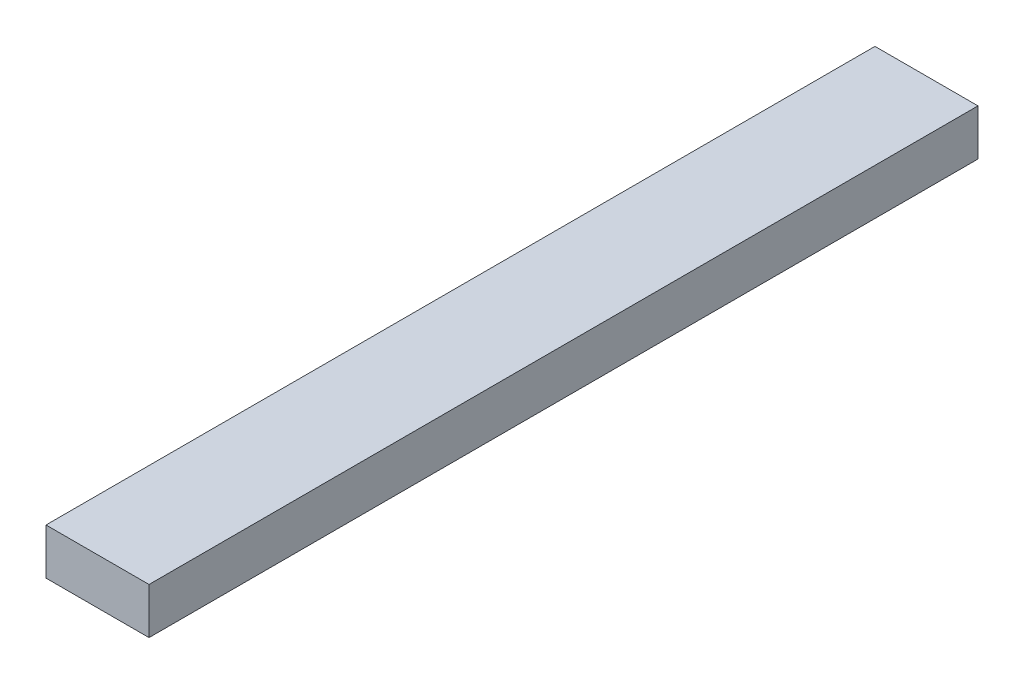
ISO-10303-21;
HEADER;
FILE_DESCRIPTION(('STEP AP214'),'2;1');
FILE_NAME('part.step','',(''),(''),'','','');
FILE_SCHEMA(('AUTOMOTIVE_DESIGN { 1 0 10303 214 1 1 1 1 }'));
ENDSEC;
DATA;
#1=APPLICATION_CONTEXT('core data for automotive mechanical design processes');
#2=APPLICATION_PROTOCOL_DEFINITION('international standard','automotive_design',2000,#1);
#3=PRODUCT_CONTEXT('',#1,'mechanical');
#4=PRODUCT('Part','Part','',(#3));
#5=PRODUCT_RELATED_PRODUCT_CATEGORY('part','',(#4));
#6=PRODUCT_DEFINITION_FORMATION('','',#4);
#7=PRODUCT_DEFINITION_CONTEXT('part definition',#1,'design');
#8=PRODUCT_DEFINITION('design','',#6,#7);
#9=PRODUCT_DEFINITION_SHAPE('','',#8);
#10=(LENGTH_UNIT() NAMED_UNIT(*) SI_UNIT(.MILLI.,.METRE.));
#11=(NAMED_UNIT(*) PLANE_ANGLE_UNIT() SI_UNIT($,.RADIAN.));
#12=(NAMED_UNIT(*) SI_UNIT($,.STERADIAN.) SOLID_ANGLE_UNIT());
#13=UNCERTAINTY_MEASURE_WITH_UNIT(LENGTH_MEASURE(1.E-05),#10,'distance_accuracy_value','');
#14=(GEOMETRIC_REPRESENTATION_CONTEXT(3) GLOBAL_UNCERTAINTY_ASSIGNED_CONTEXT((#13)) GLOBAL_UNIT_ASSIGNED_CONTEXT((#10,
#11,#12)) REPRESENTATION_CONTEXT('',''));
#15=CARTESIAN_POINT('',(0.,0.,0.));
#16=DIRECTION('',(0.,0.,1.));
#17=DIRECTION('',(1.,0.,0.));
#18=AXIS2_PLACEMENT_3D('',#15,#16,#17);
#19=CARTESIAN_POINT('',(18.6436,8.3312,150.));
#20=DIRECTION('',(0.,-1.,0.));
#21=DIRECTION('',(0.,0.,-1.));
#22=AXIS2_PLACEMENT_3D('',#19,#20,#21);
#23=PLANE('',#22);
#24=DIRECTION('',(-1.,0.,0.));
#25=VECTOR('',#24,1.);
#26=CARTESIAN_POINT('',(18.6436,8.3312,-150.));
#27=LINE('',#26,#25);
#28=CARTESIAN_POINT('',(18.6436,8.3312,-150.));
#29=VERTEX_POINT('',#28);
#30=CARTESIAN_POINT('',(-18.6436,8.3312,-150.));
#31=VERTEX_POINT('',#30);
#32=EDGE_CURVE('E104',#29,#31,#27,.T.);
#33=ORIENTED_EDGE('',*,*,#32,.T.);
#34=DIRECTION('',(0.,0.,-1.));
#35=VECTOR('',#34,1.);
#36=CARTESIAN_POINT('',(-18.6436,8.3312,150.));
#37=LINE('',#36,#35);
#38=CARTESIAN_POINT('',(-18.6436,8.3312,150.));
#39=VERTEX_POINT('',#38);
#40=EDGE_CURVE('E11',#39,#31,#37,.T.);
#41=ORIENTED_EDGE('',*,*,#40,.F.);
#42=DIRECTION('',(-1.,0.,0.));
#43=VECTOR('',#42,1.);
#44=CARTESIAN_POINT('',(18.6436,8.3312,150.));
#45=LINE('',#44,#43);
#46=CARTESIAN_POINT('',(18.6436,8.3312,150.));
#47=VERTEX_POINT('',#46);
#48=EDGE_CURVE('E92',#47,#39,#45,.T.);
#49=ORIENTED_EDGE('',*,*,#48,.F.);
#50=DIRECTION('',(0.,0.,-1.));
#51=VECTOR('',#50,1.);
#52=CARTESIAN_POINT('',(18.6436,8.3312,150.));
#53=LINE('',#52,#51);
#54=EDGE_CURVE('E100',#47,#29,#53,.T.);
#55=ORIENTED_EDGE('',*,*,#54,.T.);
#56=EDGE_LOOP('',(#33,#41,#49,#55));
#57=FACE_BOUND('',#56,.T.);
#58=ADVANCED_FACE('F41',(#57),#23,.F.);
#59=CARTESIAN_POINT('',(-18.6436,-8.3312,150.));
#60=DIRECTION('',(1.,0.,0.));
#61=DIRECTION('',(0.,0.,-1.));
#62=AXIS2_PLACEMENT_3D('',#59,#60,#61);
#63=PLANE('',#62);
#64=DIRECTION('',(0.,-1.,0.));
#65=VECTOR('',#64,1.);
#66=CARTESIAN_POINT('',(-18.6436,-8.3312,-150.));
#67=LINE('',#66,#65);
#68=CARTESIAN_POINT('',(-18.6436,-8.3312,-150.));
#69=VERTEX_POINT('',#68);
#70=EDGE_CURVE('E96',#31,#69,#67,.T.);
#71=ORIENTED_EDGE('',*,*,#70,.T.);
#72=DIRECTION('',(0.,0.,-1.));
#73=VECTOR('',#72,1.);
#74=CARTESIAN_POINT('',(-18.6436,-8.3312,150.));
#75=LINE('',#74,#73);
#76=CARTESIAN_POINT('',(-18.6436,-8.3312,150.));
#77=VERTEX_POINT('',#76);
#78=EDGE_CURVE('E49',#77,#69,#75,.T.);
#79=ORIENTED_EDGE('',*,*,#78,.F.);
#80=DIRECTION('',(0.,-1.,0.));
#81=VECTOR('',#80,1.);
#82=CARTESIAN_POINT('',(-18.6436,-8.3312,150.));
#83=LINE('',#82,#81);
#84=EDGE_CURVE('E87',#39,#77,#83,.T.);
#85=ORIENTED_EDGE('',*,*,#84,.F.);
#86=ORIENTED_EDGE('',*,*,#40,.T.);
#87=EDGE_LOOP('',(#71,#79,#85,#86));
#88=FACE_BOUND('',#87,.T.);
#89=ADVANCED_FACE('F95',(#88),#63,.F.);
#90=CARTESIAN_POINT('',(18.6436,-8.3312,150.));
#91=DIRECTION('',(0.,1.,0.));
#92=DIRECTION('',(0.,0.,1.));
#93=AXIS2_PLACEMENT_3D('',#90,#91,#92);
#94=PLANE('',#93);
#95=DIRECTION('',(1.,0.,0.));
#96=VECTOR('',#95,1.);
#97=CARTESIAN_POINT('',(18.6436,-8.3312,-150.));
#98=LINE('',#97,#96);
#99=CARTESIAN_POINT('',(18.6436,-8.3312,-150.));
#100=VERTEX_POINT('',#99);
#101=EDGE_CURVE('E74',#69,#100,#98,.T.);
#102=ORIENTED_EDGE('',*,*,#101,.T.);
#103=DIRECTION('',(0.,0.,-1.));
#104=VECTOR('',#103,1.);
#105=CARTESIAN_POINT('',(18.6436,-8.3312,150.));
#106=LINE('',#105,#104);
#107=CARTESIAN_POINT('',(18.6436,-8.3312,150.));
#108=VERTEX_POINT('',#107);
#109=EDGE_CURVE('E97',#108,#100,#106,.T.);
#110=ORIENTED_EDGE('',*,*,#109,.F.);
#111=DIRECTION('',(1.,0.,0.));
#112=VECTOR('',#111,1.);
#113=CARTESIAN_POINT('',(18.6436,-8.3312,150.));
#114=LINE('',#113,#112);
#115=EDGE_CURVE('E90',#77,#108,#114,.T.);
#116=ORIENTED_EDGE('',*,*,#115,.F.);
#117=ORIENTED_EDGE('',*,*,#78,.T.);
#118=EDGE_LOOP('',(#102,#110,#116,#117));
#119=FACE_BOUND('',#118,.T.);
#120=ADVANCED_FACE('F98',(#119),#94,.F.);
#121=CARTESIAN_POINT('',(18.6436,-8.3312,150.));
#122=DIRECTION('',(-1.,0.,0.));
#123=DIRECTION('',(0.,0.,1.));
#124=AXIS2_PLACEMENT_3D('',#121,#122,#123);
#125=PLANE('',#124);
#126=DIRECTION('',(0.,1.,0.));
#127=VECTOR('',#126,1.);
#128=CARTESIAN_POINT('',(18.6436,-8.3312,-150.));
#129=LINE('',#128,#127);
#130=EDGE_CURVE('E80',#100,#29,#129,.T.);
#131=ORIENTED_EDGE('',*,*,#130,.T.);
#132=ORIENTED_EDGE('',*,*,#54,.F.);
#133=DIRECTION('',(0.,1.,0.));
#134=VECTOR('',#133,1.);
#135=CARTESIAN_POINT('',(18.6436,-8.3312,150.));
#136=LINE('',#135,#134);
#137=EDGE_CURVE('E57',#108,#47,#136,.T.);
#138=ORIENTED_EDGE('',*,*,#137,.F.);
#139=ORIENTED_EDGE('',*,*,#109,.T.);
#140=EDGE_LOOP('',(#131,#132,#138,#139));
#141=FACE_BOUND('',#140,.T.);
#142=ADVANCED_FACE('F111',(#141),#125,.F.);
#143=CARTESIAN_POINT('',(0.,0.,150.));
#144=DIRECTION('',(0.,0.,-1.));
#145=DIRECTION('',(-1.,0.,0.));
#146=AXIS2_PLACEMENT_3D('',#143,#144,#145);
#147=PLANE('',#146);
#148=ORIENTED_EDGE('',*,*,#48,.T.);
#149=ORIENTED_EDGE('',*,*,#84,.T.);
#150=ORIENTED_EDGE('',*,*,#115,.T.);
#151=ORIENTED_EDGE('',*,*,#137,.T.);
#152=EDGE_LOOP('',(#148,#149,#150,#151));
#153=FACE_BOUND('',#152,.T.);
#154=ADVANCED_FACE('F88',(#153),#147,.F.);
#155=CARTESIAN_POINT('',(0.,0.,-150.));
#156=DIRECTION('',(0.,0.,-1.));
#157=DIRECTION('',(-1.,0.,0.));
#158=AXIS2_PLACEMENT_3D('',#155,#156,#157);
#159=PLANE('',#158);
#160=ORIENTED_EDGE('',*,*,#32,.F.);
#161=ORIENTED_EDGE('',*,*,#130,.F.);
#162=ORIENTED_EDGE('',*,*,#101,.F.);
#163=ORIENTED_EDGE('',*,*,#70,.F.);
#164=EDGE_LOOP('',(#160,#161,#162,#163));
#165=FACE_BOUND('',#164,.T.);
#166=ADVANCED_FACE('F114',(#165),#159,.T.);
#167=CLOSED_SHELL('',(#58,#89,#120,#142,#154,#166));
#168=MANIFOLD_SOLID_BREP('B2',#167);
#169=ADVANCED_BREP_SHAPE_REPRESENTATION('',(#18,#168),#14);
#170=SHAPE_DEFINITION_REPRESENTATION(#9,#169);
ENDSEC;
END-ISO-10303-21;
